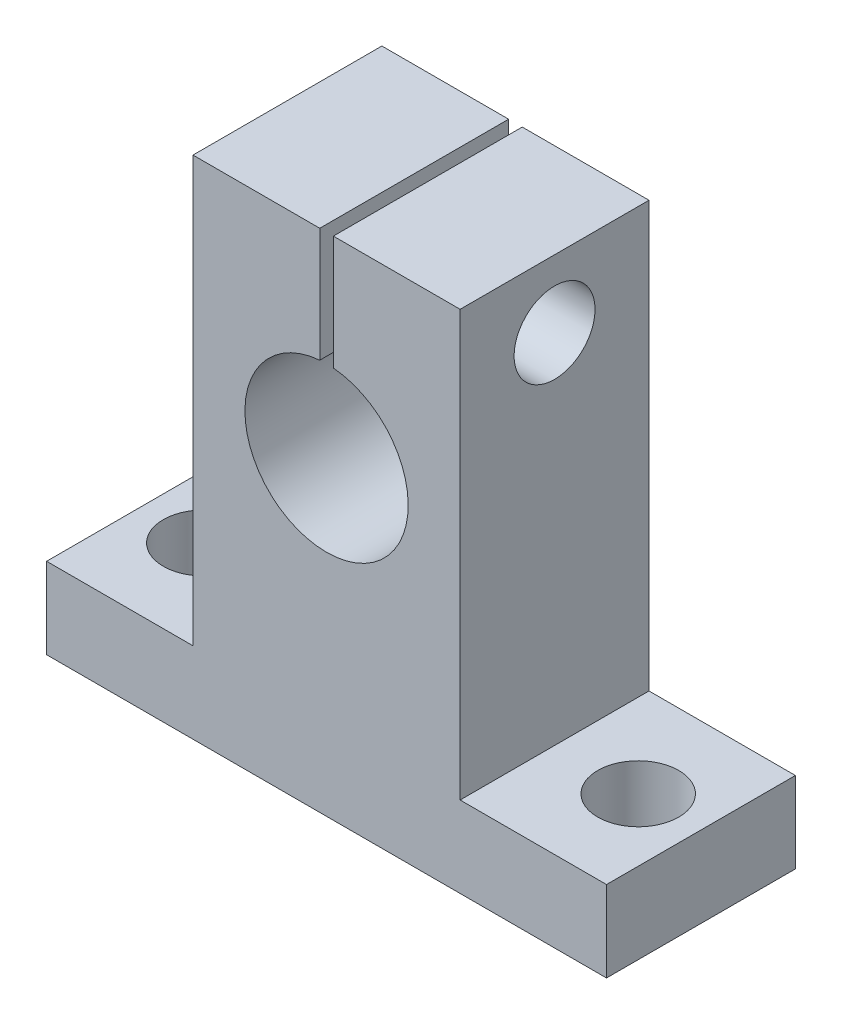
ISO-10303-21;
HEADER;
FILE_DESCRIPTION(('STEP AP214'),'2;1');
FILE_NAME('part.step','',(''),(''),'','','');
FILE_SCHEMA(('AUTOMOTIVE_DESIGN { 1 0 10303 214 1 1 1 1 }'));
ENDSEC;
DATA;
#1=APPLICATION_CONTEXT('core data for automotive mechanical design processes');
#2=APPLICATION_PROTOCOL_DEFINITION('international standard','automotive_design',2000,#1);
#3=PRODUCT_CONTEXT('',#1,'mechanical');
#4=PRODUCT('Part','Part','',(#3));
#5=PRODUCT_RELATED_PRODUCT_CATEGORY('part','',(#4));
#6=PRODUCT_DEFINITION_FORMATION('','',#4);
#7=PRODUCT_DEFINITION_CONTEXT('part definition',#1,'design');
#8=PRODUCT_DEFINITION('design','',#6,#7);
#9=PRODUCT_DEFINITION_SHAPE('','',#8);
#10=(LENGTH_UNIT() NAMED_UNIT(*) SI_UNIT(.MILLI.,.METRE.));
#11=(NAMED_UNIT(*) PLANE_ANGLE_UNIT() SI_UNIT($,.RADIAN.));
#12=(NAMED_UNIT(*) SI_UNIT($,.STERADIAN.) SOLID_ANGLE_UNIT());
#13=UNCERTAINTY_MEASURE_WITH_UNIT(LENGTH_MEASURE(1.E-05),#10,'distance_accuracy_value','');
#14=(GEOMETRIC_REPRESENTATION_CONTEXT(3) GLOBAL_UNCERTAINTY_ASSIGNED_CONTEXT((#13)) GLOBAL_UNIT_ASSIGNED_CONTEXT((#10,
#11,#12)) REPRESENTATION_CONTEXT('',''));
#15=CARTESIAN_POINT('',(0.,0.,0.));
#16=DIRECTION('',(0.,0.,1.));
#17=DIRECTION('',(1.,0.,0.));
#18=AXIS2_PLACEMENT_3D('',#15,#16,#17);
#19=CARTESIAN_POINT('',(-0.50416666666667,14.5,-14.));
#20=DIRECTION('',(0.,1.,0.));
#21=DIRECTION('',(-1.,0.,0.));
#22=AXIS2_PLACEMENT_3D('',#19,#20,#21);
#23=PLANE('',#22);
#24=DIRECTION('',(-1.,0.,0.));
#25=VECTOR('',#24,1.);
#26=CARTESIAN_POINT('',(-0.50416666666667,14.5,0.));
#27=LINE('',#26,#25);
#28=CARTESIAN_POINT('',(-0.50416666666667,14.5,0.));
#29=VERTEX_POINT('',#28);
#30=CARTESIAN_POINT('',(-9.9,14.5,0.));
#31=VERTEX_POINT('',#30);
#32=EDGE_CURVE('E156',#29,#31,#27,.T.);
#33=ORIENTED_EDGE('',*,*,#32,.F.);
#34=DIRECTION('',(0.,0.,1.));
#35=VECTOR('',#34,1.);
#36=CARTESIAN_POINT('',(-0.50416666666667,14.5,-14.));
#37=LINE('',#36,#35);
#38=CARTESIAN_POINT('',(-0.50416666666667,14.5,-14.));
#39=VERTEX_POINT('',#38);
#40=EDGE_CURVE('E11',#39,#29,#37,.T.);
#41=ORIENTED_EDGE('',*,*,#40,.F.);
#42=DIRECTION('',(-1.,0.,0.));
#43=VECTOR('',#42,1.);
#44=CARTESIAN_POINT('',(-0.50416666666667,14.5,-14.));
#45=LINE('',#44,#43);
#46=CARTESIAN_POINT('',(-9.9,14.5,-14.));
#47=VERTEX_POINT('',#46);
#48=EDGE_CURVE('E186',#39,#47,#45,.T.);
#49=ORIENTED_EDGE('',*,*,#48,.T.);
#50=DIRECTION('',(0.,0.,1.));
#51=VECTOR('',#50,1.);
#52=CARTESIAN_POINT('',(-9.9,14.5,-14.));
#53=LINE('',#52,#51);
#54=EDGE_CURVE('E36',#47,#31,#53,.T.);
#55=ORIENTED_EDGE('',*,*,#54,.T.);
#56=EDGE_LOOP('',(#33,#41,#49,#55));
#57=FACE_BOUND('',#56,.T.);
#58=ADVANCED_FACE('F33',(#57),#23,.T.);
#59=CARTESIAN_POINT('',(-0.50416666666667,14.5,-14.));
#60=DIRECTION('',(-1.,0.,0.));
#61=DIRECTION('',(0.,-1.,0.));
#62=AXIS2_PLACEMENT_3D('',#59,#60,#61);
#63=PLANE('',#62);
#64=CARTESIAN_POINT('',(-0.50416666666667,9.5,-7.));
#65=DIRECTION('',(-1.,0.,0.));
#66=DIRECTION('',(0.,-1.,0.));
#67=AXIS2_PLACEMENT_3D('',#64,#65,#66);
#68=CIRCLE('',#67,3.);
#69=CARTESIAN_POINT('',(-0.50416666666667,6.5,-7.));
#70=VERTEX_POINT('',#69);
#71=EDGE_CURVE('E160',#70,#70,#68,.T.);
#72=ORIENTED_EDGE('',*,*,#71,.T.);
#73=EDGE_LOOP('',(#72));
#74=FACE_BOUND('',#73,.T.);
#75=DIRECTION('',(0.,-1.,0.));
#76=VECTOR('',#75,1.);
#77=CARTESIAN_POINT('',(-0.50416666666667,14.5,0.));
#78=LINE('',#77,#76);
#79=CARTESIAN_POINT('',(-0.504166666666669,6.02895645798029,0.));
#80=VERTEX_POINT('',#79);
#81=EDGE_CURVE('E90',#29,#80,#78,.T.);
#82=ORIENTED_EDGE('',*,*,#81,.T.);
#83=DIRECTION('',(0.,0.,1.));
#84=VECTOR('',#83,1.);
#85=CARTESIAN_POINT('',(-0.504166666666669,6.02895645798029,-14.));
#86=LINE('',#85,#84);
#87=CARTESIAN_POINT('',(-0.504166666666669,6.02895645798029,-14.));
#88=VERTEX_POINT('',#87);
#89=EDGE_CURVE('E42',#88,#80,#86,.T.);
#90=ORIENTED_EDGE('',*,*,#89,.F.);
#91=DIRECTION('',(0.,-1.,0.));
#92=VECTOR('',#91,1.);
#93=CARTESIAN_POINT('',(-0.50416666666667,14.5,-14.));
#94=LINE('',#93,#92);
#95=EDGE_CURVE('E135',#39,#88,#94,.T.);
#96=ORIENTED_EDGE('',*,*,#95,.F.);
#97=ORIENTED_EDGE('',*,*,#40,.T.);
#98=EDGE_LOOP('',(#82,#90,#96,#97));
#99=FACE_BOUND('',#98,.T.);
#100=ADVANCED_FACE('F299',(#74,#99),#63,.F.);
#101=CARTESIAN_POINT('',(0.,0.,-14.));
#102=DIRECTION('',(0.,0.,1.));
#103=DIRECTION('',(1.,0.,0.));
#104=AXIS2_PLACEMENT_3D('',#101,#102,#103);
#105=CYLINDRICAL_SURFACE('',#104,6.05);
#106=CARTESIAN_POINT('',(0.,0.,0.));
#107=DIRECTION('',(0.,0.,1.));
#108=DIRECTION('',(1.,0.,0.));
#109=AXIS2_PLACEMENT_3D('',#106,#107,#108);
#110=CIRCLE('',#109,6.05);
#111=CARTESIAN_POINT('',(0.504166666666665,6.02895645798029,0.));
#112=VERTEX_POINT('',#111);
#113=EDGE_CURVE('E142',#80,#112,#110,.T.);
#114=ORIENTED_EDGE('',*,*,#113,.T.);
#115=DIRECTION('',(0.,0.,1.));
#116=VECTOR('',#115,1.);
#117=CARTESIAN_POINT('',(0.504166666666665,6.02895645798029,-14.));
#118=LINE('',#117,#116);
#119=CARTESIAN_POINT('',(0.504166666666665,6.02895645798029,-14.));
#120=VERTEX_POINT('',#119);
#121=EDGE_CURVE('E139',#120,#112,#118,.T.);
#122=ORIENTED_EDGE('',*,*,#121,.F.);
#123=CARTESIAN_POINT('',(0.,0.,-14.));
#124=DIRECTION('',(0.,0.,1.));
#125=DIRECTION('',(1.,0.,0.));
#126=AXIS2_PLACEMENT_3D('',#123,#124,#125);
#127=CIRCLE('',#126,6.05);
#128=EDGE_CURVE('E127',#88,#120,#127,.T.);
#129=ORIENTED_EDGE('',*,*,#128,.F.);
#130=ORIENTED_EDGE('',*,*,#89,.T.);
#131=EDGE_LOOP('',(#114,#122,#129,#130));
#132=FACE_BOUND('',#131,.T.);
#133=ADVANCED_FACE('F140',(#132),#105,.F.);
#134=CARTESIAN_POINT('',(0.504166666666664,14.5,-14.));
#135=DIRECTION('',(-1.,0.,0.));
#136=DIRECTION('',(0.,-1.,0.));
#137=AXIS2_PLACEMENT_3D('',#134,#135,#136);
#138=PLANE('',#137);
#139=CARTESIAN_POINT('',(0.504166666666663,9.5,-7.));
#140=DIRECTION('',(-1.,0.,0.));
#141=DIRECTION('',(0.,-1.,0.));
#142=AXIS2_PLACEMENT_3D('',#139,#140,#141);
#143=CIRCLE('',#142,3.);
#144=CARTESIAN_POINT('',(0.504166666666664,6.5,-7.));
#145=VERTEX_POINT('',#144);
#146=EDGE_CURVE('E239',#145,#145,#143,.T.);
#147=ORIENTED_EDGE('',*,*,#146,.F.);
#148=EDGE_LOOP('',(#147));
#149=FACE_BOUND('',#148,.T.);
#150=DIRECTION('',(0.,-1.,0.));
#151=VECTOR('',#150,1.);
#152=CARTESIAN_POINT('',(0.504166666666664,14.5,0.));
#153=LINE('',#152,#151);
#154=CARTESIAN_POINT('',(0.504166666666664,14.5,0.));
#155=VERTEX_POINT('',#154);
#156=EDGE_CURVE('E183',#155,#112,#153,.T.);
#157=ORIENTED_EDGE('',*,*,#156,.F.);
#158=DIRECTION('',(0.,0.,1.));
#159=VECTOR('',#158,1.);
#160=CARTESIAN_POINT('',(0.504166666666664,14.5,-14.));
#161=LINE('',#160,#159);
#162=CARTESIAN_POINT('',(0.504166666666664,14.5,-14.));
#163=VERTEX_POINT('',#162);
#164=EDGE_CURVE('E146',#163,#155,#161,.T.);
#165=ORIENTED_EDGE('',*,*,#164,.F.);
#166=DIRECTION('',(0.,-1.,0.));
#167=VECTOR('',#166,1.);
#168=CARTESIAN_POINT('',(0.504166666666664,14.5,-14.));
#169=LINE('',#168,#167);
#170=EDGE_CURVE('E133',#163,#120,#169,.T.);
#171=ORIENTED_EDGE('',*,*,#170,.T.);
#172=ORIENTED_EDGE('',*,*,#121,.T.);
#173=EDGE_LOOP('',(#157,#165,#171,#172));
#174=FACE_BOUND('',#173,.T.);
#175=ADVANCED_FACE('F148',(#149,#174),#138,.T.);
#176=CARTESIAN_POINT('',(9.9,14.5,-14.));
#177=DIRECTION('',(0.,1.,0.));
#178=DIRECTION('',(-1.,0.,0.));
#179=AXIS2_PLACEMENT_3D('',#176,#177,#178);
#180=PLANE('',#179);
#181=DIRECTION('',(-1.,0.,0.));
#182=VECTOR('',#181,1.);
#183=CARTESIAN_POINT('',(9.9,14.5,0.));
#184=LINE('',#183,#182);
#185=CARTESIAN_POINT('',(9.9,14.5,0.));
#186=VERTEX_POINT('',#185);
#187=EDGE_CURVE('E180',#186,#155,#184,.T.);
#188=ORIENTED_EDGE('',*,*,#187,.F.);
#189=DIRECTION('',(0.,0.,1.));
#190=VECTOR('',#189,1.);
#191=CARTESIAN_POINT('',(9.9,14.5,-14.));
#192=LINE('',#191,#190);
#193=CARTESIAN_POINT('',(9.9,14.5,-14.));
#194=VERTEX_POINT('',#193);
#195=EDGE_CURVE('E190',#194,#186,#192,.T.);
#196=ORIENTED_EDGE('',*,*,#195,.F.);
#197=DIRECTION('',(-1.,0.,0.));
#198=VECTOR('',#197,1.);
#199=CARTESIAN_POINT('',(9.9,14.5,-14.));
#200=LINE('',#199,#198);
#201=EDGE_CURVE('E149',#194,#163,#200,.T.);
#202=ORIENTED_EDGE('',*,*,#201,.T.);
#203=ORIENTED_EDGE('',*,*,#164,.T.);
#204=EDGE_LOOP('',(#188,#196,#202,#203));
#205=FACE_BOUND('',#204,.T.);
#206=ADVANCED_FACE('F210',(#205),#180,.T.);
#207=CARTESIAN_POINT('',(9.9,14.5,-14.));
#208=DIRECTION('',(-1.,0.,0.));
#209=DIRECTION('',(0.,-1.,0.));
#210=AXIS2_PLACEMENT_3D('',#207,#208,#209);
#211=PLANE('',#210);
#212=CARTESIAN_POINT('',(9.9,9.5,-7.));
#213=DIRECTION('',(-1.,0.,0.));
#214=DIRECTION('',(0.,-1.,0.));
#215=AXIS2_PLACEMENT_3D('',#212,#213,#214);
#216=CIRCLE('',#215,3.);
#217=CARTESIAN_POINT('',(9.9,6.5,-7.));
#218=VERTEX_POINT('',#217);
#219=EDGE_CURVE('E242',#218,#218,#216,.T.);
#220=ORIENTED_EDGE('',*,*,#219,.T.);
#221=EDGE_LOOP('',(#220));
#222=FACE_BOUND('',#221,.T.);
#223=DIRECTION('',(0.,-1.,0.));
#224=VECTOR('',#223,1.);
#225=CARTESIAN_POINT('',(9.9,14.5,0.));
#226=LINE('',#225,#224);
#227=CARTESIAN_POINT('',(9.9,-17.,0.));
#228=VERTEX_POINT('',#227);
#229=EDGE_CURVE('E177',#186,#228,#226,.T.);
#230=ORIENTED_EDGE('',*,*,#229,.T.);
#231=DIRECTION('',(0.,0.,1.));
#232=VECTOR('',#231,1.);
#233=CARTESIAN_POINT('',(9.9,-17.,-14.));
#234=LINE('',#233,#232);
#235=CARTESIAN_POINT('',(9.9,-17.,-14.));
#236=VERTEX_POINT('',#235);
#237=EDGE_CURVE('E192',#236,#228,#234,.T.);
#238=ORIENTED_EDGE('',*,*,#237,.F.);
#239=DIRECTION('',(0.,-1.,0.));
#240=VECTOR('',#239,1.);
#241=CARTESIAN_POINT('',(9.9,14.5,-14.));
#242=LINE('',#241,#240);
#243=EDGE_CURVE('E151',#194,#236,#242,.T.);
#244=ORIENTED_EDGE('',*,*,#243,.F.);
#245=ORIENTED_EDGE('',*,*,#195,.T.);
#246=EDGE_LOOP('',(#230,#238,#244,#245));
#247=FACE_BOUND('',#246,.T.);
#248=ADVANCED_FACE('F219',(#222,#247),#211,.F.);
#249=CARTESIAN_POINT('',(20.75,-17.,-14.));
#250=DIRECTION('',(0.,1.,0.));
#251=DIRECTION('',(0.,0.,1.));
#252=AXIS2_PLACEMENT_3D('',#249,#250,#251);
#253=PLANE('',#252);
#254=CARTESIAN_POINT('',(16.1,-17.,-7.));
#255=DIRECTION('',(0.,1.,0.));
#256=DIRECTION('',(1.,0.,0.));
#257=AXIS2_PLACEMENT_3D('',#254,#255,#256);
#258=CIRCLE('',#257,3.);
#259=CARTESIAN_POINT('',(19.1,-17.,-7.));
#260=VERTEX_POINT('',#259);
#261=EDGE_CURVE('E249',#260,#260,#258,.T.);
#262=ORIENTED_EDGE('',*,*,#261,.F.);
#263=EDGE_LOOP('',(#262));
#264=FACE_BOUND('',#263,.T.);
#265=DIRECTION('',(-1.,0.,0.));
#266=VECTOR('',#265,1.);
#267=CARTESIAN_POINT('',(20.75,-17.,0.));
#268=LINE('',#267,#266);
#269=CARTESIAN_POINT('',(20.75,-17.,0.));
#270=VERTEX_POINT('',#269);
#271=EDGE_CURVE('E174',#270,#228,#268,.T.);
#272=ORIENTED_EDGE('',*,*,#271,.F.);
#273=DIRECTION('',(0.,0.,1.));
#274=VECTOR('',#273,1.);
#275=CARTESIAN_POINT('',(20.75,-17.,-14.));
#276=LINE('',#275,#274);
#277=CARTESIAN_POINT('',(20.75,-17.,-14.));
#278=VERTEX_POINT('',#277);
#279=EDGE_CURVE('E194',#278,#270,#276,.T.);
#280=ORIENTED_EDGE('',*,*,#279,.F.);
#281=DIRECTION('',(-1.,0.,0.));
#282=VECTOR('',#281,1.);
#283=CARTESIAN_POINT('',(20.75,-17.,-14.));
#284=LINE('',#283,#282);
#285=EDGE_CURVE('E216',#278,#236,#284,.T.);
#286=ORIENTED_EDGE('',*,*,#285,.T.);
#287=ORIENTED_EDGE('',*,*,#237,.T.);
#288=EDGE_LOOP('',(#272,#280,#286,#287));
#289=FACE_BOUND('',#288,.T.);
#290=ADVANCED_FACE('F222',(#264,#289),#253,.T.);
#291=CARTESIAN_POINT('',(20.75,-23.,-14.));
#292=DIRECTION('',(1.,0.,0.));
#293=DIRECTION('',(0.,0.,-1.));
#294=AXIS2_PLACEMENT_3D('',#291,#292,#293);
#295=PLANE('',#294);
#296=DIRECTION('',(0.,1.,0.));
#297=VECTOR('',#296,1.);
#298=CARTESIAN_POINT('',(20.75,-23.,0.));
#299=LINE('',#298,#297);
#300=CARTESIAN_POINT('',(20.75,-23.,0.));
#301=VERTEX_POINT('',#300);
#302=EDGE_CURVE('E171',#301,#270,#299,.T.);
#303=ORIENTED_EDGE('',*,*,#302,.F.);
#304=DIRECTION('',(0.,0.,1.));
#305=VECTOR('',#304,1.);
#306=CARTESIAN_POINT('',(20.75,-23.,-14.));
#307=LINE('',#306,#305);
#308=CARTESIAN_POINT('',(20.75,-23.,-14.));
#309=VERTEX_POINT('',#308);
#310=EDGE_CURVE('E196',#309,#301,#307,.T.);
#311=ORIENTED_EDGE('',*,*,#310,.F.);
#312=DIRECTION('',(0.,1.,0.));
#313=VECTOR('',#312,1.);
#314=CARTESIAN_POINT('',(20.75,-23.,-14.));
#315=LINE('',#314,#313);
#316=EDGE_CURVE('E223',#309,#278,#315,.T.);
#317=ORIENTED_EDGE('',*,*,#316,.T.);
#318=ORIENTED_EDGE('',*,*,#279,.T.);
#319=EDGE_LOOP('',(#303,#311,#317,#318));
#320=FACE_BOUND('',#319,.T.);
#321=ADVANCED_FACE('F288',(#320),#295,.T.);
#322=CARTESIAN_POINT('',(20.75,-23.,-14.));
#323=DIRECTION('',(0.,1.,0.));
#324=DIRECTION('',(0.,0.,1.));
#325=AXIS2_PLACEMENT_3D('',#322,#323,#324);
#326=PLANE('',#325);
#327=CARTESIAN_POINT('',(-16.1,-23.,-7.));
#328=DIRECTION('',(0.,1.,0.));
#329=DIRECTION('',(-1.,0.,0.));
#330=AXIS2_PLACEMENT_3D('',#327,#328,#329);
#331=CIRCLE('',#330,3.);
#332=CARTESIAN_POINT('',(-19.1,-23.,-7.));
#333=VERTEX_POINT('',#332);
#334=EDGE_CURVE('E248',#333,#333,#331,.T.);
#335=ORIENTED_EDGE('',*,*,#334,.T.);
#336=EDGE_LOOP('',(#335));
#337=FACE_BOUND('',#336,.T.);
#338=CARTESIAN_POINT('',(16.1,-23.,-7.));
#339=DIRECTION('',(0.,1.,0.));
#340=DIRECTION('',(1.,0.,0.));
#341=AXIS2_PLACEMENT_3D('',#338,#339,#340);
#342=CIRCLE('',#341,3.);
#343=CARTESIAN_POINT('',(19.1,-23.,-7.));
#344=VERTEX_POINT('',#343);
#345=EDGE_CURVE('E252',#344,#344,#342,.T.);
#346=ORIENTED_EDGE('',*,*,#345,.T.);
#347=EDGE_LOOP('',(#346));
#348=FACE_BOUND('',#347,.T.);
#349=DIRECTION('',(-1.,0.,0.));
#350=VECTOR('',#349,1.);
#351=CARTESIAN_POINT('',(20.75,-23.,0.));
#352=LINE('',#351,#350);
#353=CARTESIAN_POINT('',(-20.75,-23.,0.));
#354=VERTEX_POINT('',#353);
#355=EDGE_CURVE('E169',#301,#354,#352,.T.);
#356=ORIENTED_EDGE('',*,*,#355,.T.);
#357=DIRECTION('',(0.,0.,1.));
#358=VECTOR('',#357,1.);
#359=CARTESIAN_POINT('',(-20.75,-23.,-14.));
#360=LINE('',#359,#358);
#361=CARTESIAN_POINT('',(-20.75,-23.,-14.));
#362=VERTEX_POINT('',#361);
#363=EDGE_CURVE('E198',#362,#354,#360,.T.);
#364=ORIENTED_EDGE('',*,*,#363,.F.);
#365=DIRECTION('',(-1.,0.,0.));
#366=VECTOR('',#365,1.);
#367=CARTESIAN_POINT('',(20.75,-23.,-14.));
#368=LINE('',#367,#366);
#369=EDGE_CURVE('E225',#309,#362,#368,.T.);
#370=ORIENTED_EDGE('',*,*,#369,.F.);
#371=ORIENTED_EDGE('',*,*,#310,.T.);
#372=EDGE_LOOP('',(#356,#364,#370,#371));
#373=FACE_BOUND('',#372,.T.);
#374=ADVANCED_FACE('F261',(#337,#348,#373),#326,.F.);
#375=CARTESIAN_POINT('',(-20.75,-23.,-14.));
#376=DIRECTION('',(1.,0.,0.));
#377=DIRECTION('',(0.,0.,-1.));
#378=AXIS2_PLACEMENT_3D('',#375,#376,#377);
#379=PLANE('',#378);
#380=DIRECTION('',(0.,1.,0.));
#381=VECTOR('',#380,1.);
#382=CARTESIAN_POINT('',(-20.75,-23.,0.));
#383=LINE('',#382,#381);
#384=CARTESIAN_POINT('',(-20.75,-17.,0.));
#385=VERTEX_POINT('',#384);
#386=EDGE_CURVE('E166',#354,#385,#383,.T.);
#387=ORIENTED_EDGE('',*,*,#386,.T.);
#388=DIRECTION('',(0.,0.,1.));
#389=VECTOR('',#388,1.);
#390=CARTESIAN_POINT('',(-20.75,-17.,-14.));
#391=LINE('',#390,#389);
#392=CARTESIAN_POINT('',(-20.75,-17.,-14.));
#393=VERTEX_POINT('',#392);
#394=EDGE_CURVE('E201',#393,#385,#391,.T.);
#395=ORIENTED_EDGE('',*,*,#394,.F.);
#396=DIRECTION('',(0.,1.,0.));
#397=VECTOR('',#396,1.);
#398=CARTESIAN_POINT('',(-20.75,-23.,-14.));
#399=LINE('',#398,#397);
#400=EDGE_CURVE('E229',#362,#393,#399,.T.);
#401=ORIENTED_EDGE('',*,*,#400,.F.);
#402=ORIENTED_EDGE('',*,*,#363,.T.);
#403=EDGE_LOOP('',(#387,#395,#401,#402));
#404=FACE_BOUND('',#403,.T.);
#405=ADVANCED_FACE('F275',(#404),#379,.F.);
#406=CARTESIAN_POINT('',(-9.9,-17.,-14.));
#407=DIRECTION('',(0.,1.,0.));
#408=DIRECTION('',(0.,0.,1.));
#409=AXIS2_PLACEMENT_3D('',#406,#407,#408);
#410=PLANE('',#409);
#411=CARTESIAN_POINT('',(-16.1,-17.,-7.));
#412=DIRECTION('',(0.,1.,0.));
#413=DIRECTION('',(-1.,0.,0.));
#414=AXIS2_PLACEMENT_3D('',#411,#412,#413);
#415=CIRCLE('',#414,3.);
#416=CARTESIAN_POINT('',(-19.1,-17.,-7.));
#417=VERTEX_POINT('',#416);
#418=EDGE_CURVE('E255',#417,#417,#415,.T.);
#419=ORIENTED_EDGE('',*,*,#418,.F.);
#420=EDGE_LOOP('',(#419));
#421=FACE_BOUND('',#420,.T.);
#422=DIRECTION('',(-1.,0.,0.));
#423=VECTOR('',#422,1.);
#424=CARTESIAN_POINT('',(-9.9,-17.,0.));
#425=LINE('',#424,#423);
#426=CARTESIAN_POINT('',(-9.9,-17.,0.));
#427=VERTEX_POINT('',#426);
#428=EDGE_CURVE('E163',#427,#385,#425,.T.);
#429=ORIENTED_EDGE('',*,*,#428,.F.);
#430=DIRECTION('',(0.,0.,1.));
#431=VECTOR('',#430,1.);
#432=CARTESIAN_POINT('',(-9.9,-17.,-14.));
#433=LINE('',#432,#431);
#434=CARTESIAN_POINT('',(-9.9,-17.,-14.));
#435=VERTEX_POINT('',#434);
#436=EDGE_CURVE('E202',#435,#427,#433,.T.);
#437=ORIENTED_EDGE('',*,*,#436,.F.);
#438=DIRECTION('',(-1.,0.,0.));
#439=VECTOR('',#438,1.);
#440=CARTESIAN_POINT('',(-9.9,-17.,-14.));
#441=LINE('',#440,#439);
#442=EDGE_CURVE('E231',#435,#393,#441,.T.);
#443=ORIENTED_EDGE('',*,*,#442,.T.);
#444=ORIENTED_EDGE('',*,*,#394,.T.);
#445=EDGE_LOOP('',(#429,#437,#443,#444));
#446=FACE_BOUND('',#445,.T.);
#447=ADVANCED_FACE('F272',(#421,#446),#410,.T.);
#448=CARTESIAN_POINT('',(-9.9,14.5,-14.));
#449=DIRECTION('',(-1.,0.,0.));
#450=DIRECTION('',(0.,-1.,0.));
#451=AXIS2_PLACEMENT_3D('',#448,#449,#450);
#452=PLANE('',#451);
#453=CARTESIAN_POINT('',(-9.9,9.5,-7.));
#454=DIRECTION('',(-1.,0.,0.));
#455=DIRECTION('',(0.,-1.,0.));
#456=AXIS2_PLACEMENT_3D('',#453,#454,#455);
#457=CIRCLE('',#456,3.);
#458=CARTESIAN_POINT('',(-9.9,6.49999999999999,-7.));
#459=VERTEX_POINT('',#458);
#460=EDGE_CURVE('E245',#459,#459,#457,.T.);
#461=ORIENTED_EDGE('',*,*,#460,.F.);
#462=EDGE_LOOP('',(#461));
#463=FACE_BOUND('',#462,.T.);
#464=DIRECTION('',(0.,-1.,0.));
#465=VECTOR('',#464,1.);
#466=CARTESIAN_POINT('',(-9.9,14.5,0.));
#467=LINE('',#466,#465);
#468=EDGE_CURVE('E159',#31,#427,#467,.T.);
#469=ORIENTED_EDGE('',*,*,#468,.F.);
#470=ORIENTED_EDGE('',*,*,#54,.F.);
#471=DIRECTION('',(0.,-1.,0.));
#472=VECTOR('',#471,1.);
#473=CARTESIAN_POINT('',(-9.9,14.5,-14.));
#474=LINE('',#473,#472);
#475=EDGE_CURVE('E234',#47,#435,#474,.T.);
#476=ORIENTED_EDGE('',*,*,#475,.T.);
#477=ORIENTED_EDGE('',*,*,#436,.T.);
#478=EDGE_LOOP('',(#469,#470,#476,#477));
#479=FACE_BOUND('',#478,.T.);
#480=ADVANCED_FACE('F204',(#463,#479),#452,.T.);
#481=CARTESIAN_POINT('',(0.,0.,-14.));
#482=DIRECTION('',(0.,0.,1.));
#483=DIRECTION('',(1.,0.,0.));
#484=AXIS2_PLACEMENT_3D('',#481,#482,#483);
#485=PLANE('',#484);
#486=ORIENTED_EDGE('',*,*,#48,.F.);
#487=ORIENTED_EDGE('',*,*,#95,.T.);
#488=ORIENTED_EDGE('',*,*,#128,.T.);
#489=ORIENTED_EDGE('',*,*,#170,.F.);
#490=ORIENTED_EDGE('',*,*,#201,.F.);
#491=ORIENTED_EDGE('',*,*,#243,.T.);
#492=ORIENTED_EDGE('',*,*,#285,.F.);
#493=ORIENTED_EDGE('',*,*,#316,.F.);
#494=ORIENTED_EDGE('',*,*,#369,.T.);
#495=ORIENTED_EDGE('',*,*,#400,.T.);
#496=ORIENTED_EDGE('',*,*,#442,.F.);
#497=ORIENTED_EDGE('',*,*,#475,.F.);
#498=EDGE_LOOP('',(#486,#487,#488,#489,#490,#491,#492,#493,#494,#495,#496,#497));
#499=FACE_BOUND('',#498,.T.);
#500=ADVANCED_FACE('F130',(#499),#485,.F.);
#501=CARTESIAN_POINT('',(0.,0.,0.));
#502=DIRECTION('',(0.,0.,1.));
#503=DIRECTION('',(1.,0.,0.));
#504=AXIS2_PLACEMENT_3D('',#501,#502,#503);
#505=PLANE('',#504);
#506=ORIENTED_EDGE('',*,*,#32,.T.);
#507=ORIENTED_EDGE('',*,*,#468,.T.);
#508=ORIENTED_EDGE('',*,*,#428,.T.);
#509=ORIENTED_EDGE('',*,*,#386,.F.);
#510=ORIENTED_EDGE('',*,*,#355,.F.);
#511=ORIENTED_EDGE('',*,*,#302,.T.);
#512=ORIENTED_EDGE('',*,*,#271,.T.);
#513=ORIENTED_EDGE('',*,*,#229,.F.);
#514=ORIENTED_EDGE('',*,*,#187,.T.);
#515=ORIENTED_EDGE('',*,*,#156,.T.);
#516=ORIENTED_EDGE('',*,*,#113,.F.);
#517=ORIENTED_EDGE('',*,*,#81,.F.);
#518=EDGE_LOOP('',(#506,#507,#508,#509,#510,#511,#512,#513,#514,#515,#516,#517));
#519=FACE_BOUND('',#518,.T.);
#520=ADVANCED_FACE('F206',(#519),#505,.T.);
#521=CARTESIAN_POINT('',(20.1,9.5,-7.));
#522=DIRECTION('',(-1.,0.,0.));
#523=DIRECTION('',(0.,-1.,0.));
#524=AXIS2_PLACEMENT_3D('',#521,#522,#523);
#525=CYLINDRICAL_SURFACE('',#524,3.);
#526=ORIENTED_EDGE('',*,*,#460,.T.);
#527=EDGE_LOOP('',(#526));
#528=FACE_BOUND('',#527,.T.);
#529=ORIENTED_EDGE('',*,*,#71,.F.);
#530=EDGE_LOOP('',(#529));
#531=FACE_BOUND('',#530,.T.);
#532=ADVANCED_FACE('F324',(#528,#531),#525,.F.);
#533=ORIENTED_EDGE('',*,*,#146,.T.);
#534=EDGE_LOOP('',(#533));
#535=FACE_BOUND('',#534,.T.);
#536=ORIENTED_EDGE('',*,*,#219,.F.);
#537=EDGE_LOOP('',(#536));
#538=FACE_BOUND('',#537,.T.);
#539=ADVANCED_FACE('F268',(#535,#538),#525,.F.);
#540=CARTESIAN_POINT('',(-16.1,-23.,-7.));
#541=DIRECTION('',(0.,1.,0.));
#542=DIRECTION('',(-1.,0.,0.));
#543=AXIS2_PLACEMENT_3D('',#540,#541,#542);
#544=CYLINDRICAL_SURFACE('',#543,3.);
#545=ORIENTED_EDGE('',*,*,#334,.F.);
#546=EDGE_LOOP('',(#545));
#547=FACE_BOUND('',#546,.T.);
#548=ORIENTED_EDGE('',*,*,#418,.T.);
#549=EDGE_LOOP('',(#548));
#550=FACE_BOUND('',#549,.T.);
#551=ADVANCED_FACE('F264',(#547,#550),#544,.F.);
#552=CARTESIAN_POINT('',(16.1,-23.,-7.));
#553=DIRECTION('',(0.,1.,0.));
#554=DIRECTION('',(-1.,0.,0.));
#555=AXIS2_PLACEMENT_3D('',#552,#553,#554);
#556=CYLINDRICAL_SURFACE('',#555,3.);
#557=ORIENTED_EDGE('',*,*,#345,.F.);
#558=EDGE_LOOP('',(#557));
#559=FACE_BOUND('',#558,.T.);
#560=ORIENTED_EDGE('',*,*,#261,.T.);
#561=EDGE_LOOP('',(#560));
#562=FACE_BOUND('',#561,.T.);
#563=ADVANCED_FACE('F267',(#559,#562),#556,.F.);
#564=CLOSED_SHELL('',(#58,#100,#133,#175,#206,#248,#290,#321,#374,#405,#447,#480,#500,#520,#532,
#539,#551,#563));
#565=MANIFOLD_SOLID_BREP('B2',#564);
#566=ADVANCED_BREP_SHAPE_REPRESENTATION('',(#18,#565),#14);
#567=SHAPE_DEFINITION_REPRESENTATION(#9,#566);
ENDSEC;
END-ISO-10303-21;
